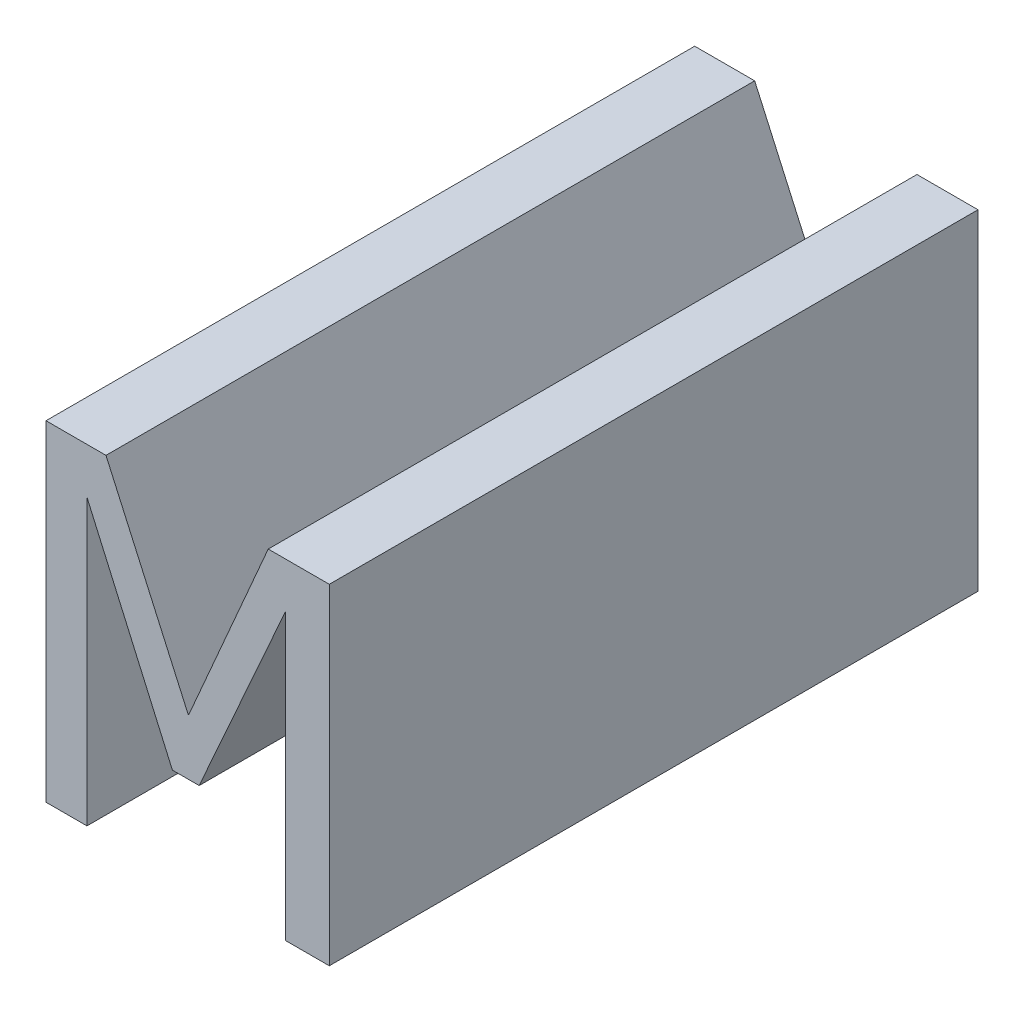
ISO-10303-21;
HEADER;
FILE_DESCRIPTION(('STEP AP214'),'2;1');
FILE_NAME('part.step','',(''),(''),'','','');
FILE_SCHEMA(('AUTOMOTIVE_DESIGN { 1 0 10303 214 1 1 1 1 }'));
ENDSEC;
DATA;
#1=APPLICATION_CONTEXT('core data for automotive mechanical design processes');
#2=APPLICATION_PROTOCOL_DEFINITION('international standard','automotive_design',2000,#1);
#3=PRODUCT_CONTEXT('',#1,'mechanical');
#4=PRODUCT('Part','Part','',(#3));
#5=PRODUCT_RELATED_PRODUCT_CATEGORY('part','',(#4));
#6=PRODUCT_DEFINITION_FORMATION('','',#4);
#7=PRODUCT_DEFINITION_CONTEXT('part definition',#1,'design');
#8=PRODUCT_DEFINITION('design','',#6,#7);
#9=PRODUCT_DEFINITION_SHAPE('','',#8);
#10=(LENGTH_UNIT() NAMED_UNIT(*) SI_UNIT(.MILLI.,.METRE.));
#11=(NAMED_UNIT(*) PLANE_ANGLE_UNIT() SI_UNIT($,.RADIAN.));
#12=(NAMED_UNIT(*) SI_UNIT($,.STERADIAN.) SOLID_ANGLE_UNIT());
#13=UNCERTAINTY_MEASURE_WITH_UNIT(LENGTH_MEASURE(1.E-05),#10,'distance_accuracy_value','');
#14=(GEOMETRIC_REPRESENTATION_CONTEXT(3) GLOBAL_UNCERTAINTY_ASSIGNED_CONTEXT((#13)) GLOBAL_UNIT_ASSIGNED_CONTEXT((#10,
#11,#12)) REPRESENTATION_CONTEXT('',''));
#15=CARTESIAN_POINT('',(0.,0.,0.));
#16=DIRECTION('',(0.,0.,1.));
#17=DIRECTION('',(1.,0.,0.));
#18=AXIS2_PLACEMENT_3D('',#15,#16,#17);
#19=CARTESIAN_POINT('',(-2.065839666338,-1.86200970024,0.));
#20=DIRECTION('',(-1.,0.,0.));
#21=DIRECTION('',(0.,-1.,0.));
#22=AXIS2_PLACEMENT_3D('',#19,#20,#21);
#23=PLANE('',#22);
#24=DIRECTION('',(0.,1.,0.));
#25=VECTOR('',#24,1.);
#26=CARTESIAN_POINT('',(-2.065839666338,-1.905886879973,0.));
#27=LINE('',#26,#25);
#28=CARTESIAN_POINT('',(-2.065839666338,-1.905886879973,0.));
#29=VERTEX_POINT('',#28);
#30=CARTESIAN_POINT('',(-2.065839666338,-1.86200970024,0.));
#31=VERTEX_POINT('',#30);
#32=EDGE_CURVE('E11',#29,#31,#27,.T.);
#33=ORIENTED_EDGE('',*,*,#32,.F.);
#34=DIRECTION('',(0.,0.,1.));
#35=VECTOR('',#34,1.);
#36=CARTESIAN_POINT('',(-2.065839666338,-1.905886879973,0.));
#37=LINE('',#36,#35);
#38=CARTESIAN_POINT('',(-2.065839666338,-1.905886879973,0.1));
#39=VERTEX_POINT('',#38);
#40=EDGE_CURVE('E24',#29,#39,#37,.T.);
#41=ORIENTED_EDGE('',*,*,#40,.T.);
#42=DIRECTION('',(0.,-1.,0.));
#43=VECTOR('',#42,1.);
#44=CARTESIAN_POINT('',(-2.065839666338,-1.905886879973,0.1));
#45=LINE('',#44,#43);
#46=CARTESIAN_POINT('',(-2.065839666338,-1.86200970024,0.1));
#47=VERTEX_POINT('',#46);
#48=EDGE_CURVE('E130',#47,#39,#45,.T.);
#49=ORIENTED_EDGE('',*,*,#48,.F.);
#50=DIRECTION('',(0.,0.,1.));
#51=VECTOR('',#50,1.);
#52=CARTESIAN_POINT('',(-2.065839666338,-1.86200970024,0.));
#53=LINE('',#52,#51);
#54=EDGE_CURVE('E211',#31,#47,#53,.T.);
#55=ORIENTED_EDGE('',*,*,#54,.F.);
#56=EDGE_LOOP('',(#33,#41,#49,#55));
#57=FACE_BOUND('',#56,.T.);
#58=ADVANCED_FACE('F17',(#57),#23,.T.);
#59=CARTESIAN_POINT('',(-2.079130778166,-1.891852786737,0.));
#60=DIRECTION('',(0.913498663408962,-0.406841728378543,0.));
#61=DIRECTION('',(0.406841728378543,0.913498663408962,0.));
#62=AXIS2_PLACEMENT_3D('',#59,#60,#61);
#63=PLANE('',#62);
#64=DIRECTION('',(-0.406841728378543,-0.913498663408962,0.));
#65=VECTOR('',#64,1.);
#66=CARTESIAN_POINT('',(-2.065839666338,-1.86200970024,0.));
#67=LINE('',#66,#65);
#68=CARTESIAN_POINT('',(-2.079130778166,-1.891852786737,0.));
#69=VERTEX_POINT('',#68);
#70=EDGE_CURVE('E209',#31,#69,#67,.T.);
#71=ORIENTED_EDGE('',*,*,#70,.F.);
#72=ORIENTED_EDGE('',*,*,#54,.T.);
#73=DIRECTION('',(0.406841728378543,0.913498663408962,0.));
#74=VECTOR('',#73,1.);
#75=CARTESIAN_POINT('',(-2.065839666338,-1.86200970024,0.1));
#76=LINE('',#75,#74);
#77=CARTESIAN_POINT('',(-2.079130778166,-1.891852786737,0.1));
#78=VERTEX_POINT('',#77);
#79=EDGE_CURVE('E207',#78,#47,#76,.T.);
#80=ORIENTED_EDGE('',*,*,#79,.F.);
#81=DIRECTION('',(0.,0.,1.));
#82=VECTOR('',#81,1.);
#83=CARTESIAN_POINT('',(-2.079130778166,-1.891852786737,0.));
#84=LINE('',#83,#82);
#85=EDGE_CURVE('E204',#69,#78,#84,.T.);
#86=ORIENTED_EDGE('',*,*,#85,.F.);
#87=EDGE_LOOP('',(#71,#72,#80,#86));
#88=FACE_BOUND('',#87,.T.);
#89=ADVANCED_FACE('F253',(#88),#63,.T.);
#90=CARTESIAN_POINT('',(-2.083258452647,-1.891852786737,0.));
#91=DIRECTION('',(0.,-1.,0.));
#92=DIRECTION('',(1.,0.,0.));
#93=AXIS2_PLACEMENT_3D('',#90,#91,#92);
#94=PLANE('',#93);
#95=DIRECTION('',(-1.,0.,0.));
#96=VECTOR('',#95,1.);
#97=CARTESIAN_POINT('',(-2.079130778166,-1.891852786737,0.));
#98=LINE('',#97,#96);
#99=CARTESIAN_POINT('',(-2.083258452647,-1.891852786737,0.));
#100=VERTEX_POINT('',#99);
#101=EDGE_CURVE('E202',#69,#100,#98,.T.);
#102=ORIENTED_EDGE('',*,*,#101,.F.);
#103=ORIENTED_EDGE('',*,*,#85,.T.);
#104=DIRECTION('',(1.,0.,0.));
#105=VECTOR('',#104,1.);
#106=CARTESIAN_POINT('',(-2.079130778166,-1.891852786737,0.1));
#107=LINE('',#106,#105);
#108=CARTESIAN_POINT('',(-2.083258452647,-1.891852786737,0.1));
#109=VERTEX_POINT('',#108);
#110=EDGE_CURVE('E199',#109,#78,#107,.T.);
#111=ORIENTED_EDGE('',*,*,#110,.F.);
#112=DIRECTION('',(0.,0.,1.));
#113=VECTOR('',#112,1.);
#114=CARTESIAN_POINT('',(-2.083258452647,-1.891852786737,0.));
#115=LINE('',#114,#113);
#116=EDGE_CURVE('E196',#100,#109,#115,.T.);
#117=ORIENTED_EDGE('',*,*,#116,.F.);
#118=EDGE_LOOP('',(#102,#103,#111,#117));
#119=FACE_BOUND('',#118,.T.);
#120=ADVANCED_FACE('F249',(#119),#94,.T.);
#121=CARTESIAN_POINT('',(-2.096425734242,-1.86200970024,0.));
#122=DIRECTION('',(-0.914904056356066,-0.403671360964854,0.));
#123=DIRECTION('',(0.403671360964854,-0.914904056356066,0.));
#124=AXIS2_PLACEMENT_3D('',#121,#122,#123);
#125=PLANE('',#124);
#126=DIRECTION('',(-0.403671360964854,0.914904056356065,0.));
#127=VECTOR('',#126,1.);
#128=CARTESIAN_POINT('',(-2.083258452647,-1.891852786737,0.));
#129=LINE('',#128,#127);
#130=CARTESIAN_POINT('',(-2.096425734242,-1.86200970024,0.));
#131=VERTEX_POINT('',#130);
#132=EDGE_CURVE('E194',#100,#131,#129,.T.);
#133=ORIENTED_EDGE('',*,*,#132,.F.);
#134=ORIENTED_EDGE('',*,*,#116,.T.);
#135=DIRECTION('',(0.403671360964854,-0.914904056356065,0.));
#136=VECTOR('',#135,1.);
#137=CARTESIAN_POINT('',(-2.083258452647,-1.891852786737,0.1));
#138=LINE('',#137,#136);
#139=CARTESIAN_POINT('',(-2.096425734242,-1.86200970024,0.1));
#140=VERTEX_POINT('',#139);
#141=EDGE_CURVE('E191',#140,#109,#138,.T.);
#142=ORIENTED_EDGE('',*,*,#141,.F.);
#143=DIRECTION('',(0.,0.,1.));
#144=VECTOR('',#143,1.);
#145=CARTESIAN_POINT('',(-2.096425734242,-1.86200970024,0.));
#146=LINE('',#145,#144);
#147=EDGE_CURVE('E188',#131,#140,#146,.T.);
#148=ORIENTED_EDGE('',*,*,#147,.F.);
#149=EDGE_LOOP('',(#133,#134,#142,#148));
#150=FACE_BOUND('',#149,.T.);
#151=ADVANCED_FACE('F245',(#150),#125,.T.);
#152=CARTESIAN_POINT('',(-2.096425734242,-1.905886879973,0.));
#153=DIRECTION('',(1.,0.,0.));
#154=DIRECTION('',(0.,1.,0.));
#155=AXIS2_PLACEMENT_3D('',#152,#153,#154);
#156=PLANE('',#155);
#157=DIRECTION('',(0.,-1.,0.));
#158=VECTOR('',#157,1.);
#159=CARTESIAN_POINT('',(-2.096425734242,-1.86200970024,0.));
#160=LINE('',#159,#158);
#161=CARTESIAN_POINT('',(-2.096425734242,-1.905886879973,0.));
#162=VERTEX_POINT('',#161);
#163=EDGE_CURVE('E186',#131,#162,#160,.T.);
#164=ORIENTED_EDGE('',*,*,#163,.F.);
#165=ORIENTED_EDGE('',*,*,#147,.T.);
#166=DIRECTION('',(0.,1.,0.));
#167=VECTOR('',#166,1.);
#168=CARTESIAN_POINT('',(-2.096425734242,-1.86200970024,0.1));
#169=LINE('',#168,#167);
#170=CARTESIAN_POINT('',(-2.096425734242,-1.905886879973,0.1));
#171=VERTEX_POINT('',#170);
#172=EDGE_CURVE('E183',#171,#140,#169,.T.);
#173=ORIENTED_EDGE('',*,*,#172,.F.);
#174=DIRECTION('',(0.,0.,1.));
#175=VECTOR('',#174,1.);
#176=CARTESIAN_POINT('',(-2.096425734242,-1.905886879973,0.));
#177=LINE('',#176,#175);
#178=EDGE_CURVE('E180',#162,#171,#177,.T.);
#179=ORIENTED_EDGE('',*,*,#178,.F.);
#180=EDGE_LOOP('',(#164,#165,#173,#179));
#181=FACE_BOUND('',#180,.T.);
#182=ADVANCED_FACE('F241',(#181),#156,.T.);
#183=CARTESIAN_POINT('',(-2.102741076198,-1.905886879973,0.));
#184=DIRECTION('',(0.,-1.,0.));
#185=DIRECTION('',(1.,0.,0.));
#186=AXIS2_PLACEMENT_3D('',#183,#184,#185);
#187=PLANE('',#186);
#188=DIRECTION('',(-1.,0.,0.));
#189=VECTOR('',#188,1.);
#190=CARTESIAN_POINT('',(-2.096425734242,-1.905886879973,0.));
#191=LINE('',#190,#189);
#192=CARTESIAN_POINT('',(-2.102741076198,-1.905886879973,0.));
#193=VERTEX_POINT('',#192);
#194=EDGE_CURVE('E178',#162,#193,#191,.T.);
#195=ORIENTED_EDGE('',*,*,#194,.F.);
#196=ORIENTED_EDGE('',*,*,#178,.T.);
#197=DIRECTION('',(1.,0.,0.));
#198=VECTOR('',#197,1.);
#199=CARTESIAN_POINT('',(-2.096425734242,-1.905886879973,0.1));
#200=LINE('',#199,#198);
#201=CARTESIAN_POINT('',(-2.102741076198,-1.905886879973,0.1));
#202=VERTEX_POINT('',#201);
#203=EDGE_CURVE('E175',#202,#171,#200,.T.);
#204=ORIENTED_EDGE('',*,*,#203,.F.);
#205=DIRECTION('',(0.,0.,1.));
#206=VECTOR('',#205,1.);
#207=CARTESIAN_POINT('',(-2.102741076198,-1.905886879973,0.));
#208=LINE('',#207,#206);
#209=EDGE_CURVE('E172',#193,#202,#208,.T.);
#210=ORIENTED_EDGE('',*,*,#209,.F.);
#211=EDGE_LOOP('',(#195,#196,#204,#210));
#212=FACE_BOUND('',#211,.T.);
#213=ADVANCED_FACE('F237',(#212),#187,.T.);
#214=CARTESIAN_POINT('',(-2.102741076198,-1.854951376877,0.));
#215=DIRECTION('',(-1.,0.,0.));
#216=DIRECTION('',(0.,-1.,0.));
#217=AXIS2_PLACEMENT_3D('',#214,#215,#216);
#218=PLANE('',#217);
#219=DIRECTION('',(0.,1.,0.));
#220=VECTOR('',#219,1.);
#221=CARTESIAN_POINT('',(-2.102741076198,-1.905886879973,0.));
#222=LINE('',#221,#220);
#223=CARTESIAN_POINT('',(-2.102741076198,-1.854951376877,0.));
#224=VERTEX_POINT('',#223);
#225=EDGE_CURVE('E170',#193,#224,#222,.T.);
#226=ORIENTED_EDGE('',*,*,#225,.F.);
#227=ORIENTED_EDGE('',*,*,#209,.T.);
#228=DIRECTION('',(0.,-1.,0.));
#229=VECTOR('',#228,1.);
#230=CARTESIAN_POINT('',(-2.102741076198,-1.905886879973,0.1));
#231=LINE('',#230,#229);
#232=CARTESIAN_POINT('',(-2.102741076198,-1.854951376877,0.1));
#233=VERTEX_POINT('',#232);
#234=EDGE_CURVE('E167',#233,#202,#231,.T.);
#235=ORIENTED_EDGE('',*,*,#234,.F.);
#236=DIRECTION('',(0.,0.,1.));
#237=VECTOR('',#236,1.);
#238=CARTESIAN_POINT('',(-2.102741076198,-1.854951376877,0.));
#239=LINE('',#238,#237);
#240=EDGE_CURVE('E164',#224,#233,#239,.T.);
#241=ORIENTED_EDGE('',*,*,#240,.F.);
#242=EDGE_LOOP('',(#226,#227,#235,#241));
#243=FACE_BOUND('',#242,.T.);
#244=ADVANCED_FACE('F233',(#243),#218,.T.);
#245=CARTESIAN_POINT('',(-2.09349508536,-1.854951376877,0.));
#246=DIRECTION('',(0.,1.,0.));
#247=DIRECTION('',(-1.,0.,0.));
#248=AXIS2_PLACEMENT_3D('',#245,#246,#247);
#249=PLANE('',#248);
#250=DIRECTION('',(1.,0.,0.));
#251=VECTOR('',#250,1.);
#252=CARTESIAN_POINT('',(-2.102741076198,-1.854951376877,0.));
#253=LINE('',#252,#251);
#254=CARTESIAN_POINT('',(-2.09349508536,-1.854951376877,0.));
#255=VERTEX_POINT('',#254);
#256=EDGE_CURVE('E162',#224,#255,#253,.T.);
#257=ORIENTED_EDGE('',*,*,#256,.F.);
#258=ORIENTED_EDGE('',*,*,#240,.T.);
#259=DIRECTION('',(-1.,0.,0.));
#260=VECTOR('',#259,1.);
#261=CARTESIAN_POINT('',(-2.102741076198,-1.854951376877,0.1));
#262=LINE('',#261,#260);
#263=CARTESIAN_POINT('',(-2.09349508536,-1.854951376877,0.1));
#264=VERTEX_POINT('',#263);
#265=EDGE_CURVE('E159',#264,#233,#262,.T.);
#266=ORIENTED_EDGE('',*,*,#265,.F.);
#267=DIRECTION('',(0.,0.,1.));
#268=VECTOR('',#267,1.);
#269=CARTESIAN_POINT('',(-2.09349508536,-1.854951376877,0.));
#270=LINE('',#269,#268);
#271=EDGE_CURVE('E156',#255,#264,#270,.T.);
#272=ORIENTED_EDGE('',*,*,#271,.F.);
#273=EDGE_LOOP('',(#257,#258,#266,#272));
#274=FACE_BOUND('',#273,.T.);
#275=ADVANCED_FACE('F229',(#274),#249,.T.);
#276=CARTESIAN_POINT('',(-2.080781847959,-1.883308500562,0.));
#277=DIRECTION('',(0.912492227721687,0.409094040958205,0.));
#278=DIRECTION('',(-0.409094040958205,0.912492227721687,0.));
#279=AXIS2_PLACEMENT_3D('',#276,#277,#278);
#280=PLANE('',#279);
#281=DIRECTION('',(0.409094040958205,-0.912492227721687,0.));
#282=VECTOR('',#281,1.);
#283=CARTESIAN_POINT('',(-2.09349508536,-1.854951376877,0.));
#284=LINE('',#283,#282);
#285=CARTESIAN_POINT('',(-2.080781847959,-1.883308500562,0.));
#286=VERTEX_POINT('',#285);
#287=EDGE_CURVE('E154',#255,#286,#284,.T.);
#288=ORIENTED_EDGE('',*,*,#287,.F.);
#289=ORIENTED_EDGE('',*,*,#271,.T.);
#290=DIRECTION('',(-0.409094040958205,0.912492227721687,0.));
#291=VECTOR('',#290,1.);
#292=CARTESIAN_POINT('',(-2.09349508536,-1.854951376877,0.1));
#293=LINE('',#292,#291);
#294=CARTESIAN_POINT('',(-2.080781847959,-1.883308500562,0.1));
#295=VERTEX_POINT('',#294);
#296=EDGE_CURVE('E151',#295,#264,#293,.T.);
#297=ORIENTED_EDGE('',*,*,#296,.F.);
#298=DIRECTION('',(0.,0.,1.));
#299=VECTOR('',#298,1.);
#300=CARTESIAN_POINT('',(-2.080781847959,-1.883308500562,0.));
#301=LINE('',#300,#299);
#302=EDGE_CURVE('E148',#286,#295,#301,.T.);
#303=ORIENTED_EDGE('',*,*,#302,.F.);
#304=EDGE_LOOP('',(#288,#289,#297,#303));
#305=FACE_BOUND('',#304,.T.);
#306=ADVANCED_FACE('F225',(#305),#280,.T.);
#307=CARTESIAN_POINT('',(-2.068481378005,-1.854951376877,0.));
#308=DIRECTION('',(-0.917409408006232,0.39794469226471,0.));
#309=DIRECTION('',(-0.39794469226471,-0.917409408006232,0.));
#310=AXIS2_PLACEMENT_3D('',#307,#308,#309);
#311=PLANE('',#310);
#312=DIRECTION('',(0.39794469226471,0.917409408006232,0.));
#313=VECTOR('',#312,1.);
#314=CARTESIAN_POINT('',(-2.080781847959,-1.883308500562,0.));
#315=LINE('',#314,#313);
#316=CARTESIAN_POINT('',(-2.068481378005,-1.854951376877,0.));
#317=VERTEX_POINT('',#316);
#318=EDGE_CURVE('E146',#286,#317,#315,.T.);
#319=ORIENTED_EDGE('',*,*,#318,.F.);
#320=ORIENTED_EDGE('',*,*,#302,.T.);
#321=DIRECTION('',(-0.39794469226471,-0.917409408006232,0.));
#322=VECTOR('',#321,1.);
#323=CARTESIAN_POINT('',(-2.080781847959,-1.883308500562,0.1));
#324=LINE('',#323,#322);
#325=CARTESIAN_POINT('',(-2.068481378005,-1.854951376877,0.1));
#326=VERTEX_POINT('',#325);
#327=EDGE_CURVE('E143',#326,#295,#324,.T.);
#328=ORIENTED_EDGE('',*,*,#327,.F.);
#329=DIRECTION('',(0.,0.,1.));
#330=VECTOR('',#329,1.);
#331=CARTESIAN_POINT('',(-2.068481378005,-1.854951376877,0.));
#332=LINE('',#331,#330);
#333=EDGE_CURVE('E140',#317,#326,#332,.T.);
#334=ORIENTED_EDGE('',*,*,#333,.F.);
#335=EDGE_LOOP('',(#319,#320,#328,#334));
#336=FACE_BOUND('',#335,.T.);
#337=ADVANCED_FACE('F221',(#336),#311,.T.);
#338=CARTESIAN_POINT('',(-2.059070280189,-1.854951376877,0.));
#339=DIRECTION('',(0.,1.,0.));
#340=DIRECTION('',(-1.,0.,0.));
#341=AXIS2_PLACEMENT_3D('',#338,#339,#340);
#342=PLANE('',#341);
#343=DIRECTION('',(1.,0.,0.));
#344=VECTOR('',#343,1.);
#345=CARTESIAN_POINT('',(-2.068481378005,-1.854951376877,0.));
#346=LINE('',#345,#344);
#347=CARTESIAN_POINT('',(-2.059070280189,-1.854951376877,0.));
#348=VERTEX_POINT('',#347);
#349=EDGE_CURVE('E138',#317,#348,#346,.T.);
#350=ORIENTED_EDGE('',*,*,#349,.F.);
#351=ORIENTED_EDGE('',*,*,#333,.T.);
#352=DIRECTION('',(-1.,0.,0.));
#353=VECTOR('',#352,1.);
#354=CARTESIAN_POINT('',(-2.068481378005,-1.854951376877,0.1));
#355=LINE('',#354,#353);
#356=CARTESIAN_POINT('',(-2.059070280189,-1.854951376877,0.1));
#357=VERTEX_POINT('',#356);
#358=EDGE_CURVE('E136',#357,#326,#355,.T.);
#359=ORIENTED_EDGE('',*,*,#358,.F.);
#360=DIRECTION('',(0.,0.,1.));
#361=VECTOR('',#360,1.);
#362=CARTESIAN_POINT('',(-2.059070280189,-1.854951376877,0.));
#363=LINE('',#362,#361);
#364=EDGE_CURVE('E115',#348,#357,#363,.T.);
#365=ORIENTED_EDGE('',*,*,#364,.F.);
#366=EDGE_LOOP('',(#350,#351,#359,#365));
#367=FACE_BOUND('',#366,.T.);
#368=ADVANCED_FACE('F219',(#367),#342,.T.);
#369=CARTESIAN_POINT('',(-2.059070280189,-1.905886879973,0.));
#370=DIRECTION('',(1.,0.,0.));
#371=DIRECTION('',(0.,1.,0.));
#372=AXIS2_PLACEMENT_3D('',#369,#370,#371);
#373=PLANE('',#372);
#374=DIRECTION('',(0.,-1.,0.));
#375=VECTOR('',#374,1.);
#376=CARTESIAN_POINT('',(-2.059070280189,-1.854951376877,0.));
#377=LINE('',#376,#375);
#378=CARTESIAN_POINT('',(-2.059070280189,-1.905886879973,0.));
#379=VERTEX_POINT('',#378);
#380=EDGE_CURVE('E119',#348,#379,#377,.T.);
#381=ORIENTED_EDGE('',*,*,#380,.F.);
#382=ORIENTED_EDGE('',*,*,#364,.T.);
#383=DIRECTION('',(0.,1.,0.));
#384=VECTOR('',#383,1.);
#385=CARTESIAN_POINT('',(-2.059070280189,-1.854951376877,0.1));
#386=LINE('',#385,#384);
#387=CARTESIAN_POINT('',(-2.059070280189,-1.905886879973,0.1));
#388=VERTEX_POINT('',#387);
#389=EDGE_CURVE('E108',#388,#357,#386,.T.);
#390=ORIENTED_EDGE('',*,*,#389,.F.);
#391=DIRECTION('',(0.,0.,1.));
#392=VECTOR('',#391,1.);
#393=CARTESIAN_POINT('',(-2.059070280189,-1.905886879973,0.));
#394=LINE('',#393,#392);
#395=EDGE_CURVE('E112',#379,#388,#394,.T.);
#396=ORIENTED_EDGE('',*,*,#395,.F.);
#397=EDGE_LOOP('',(#381,#382,#390,#396));
#398=FACE_BOUND('',#397,.T.);
#399=ADVANCED_FACE('F111',(#398),#373,.T.);
#400=CARTESIAN_POINT('',(-2.065839666338,-1.905886879973,0.));
#401=DIRECTION('',(0.,-1.,0.));
#402=DIRECTION('',(1.,0.,0.));
#403=AXIS2_PLACEMENT_3D('',#400,#401,#402);
#404=PLANE('',#403);
#405=DIRECTION('',(-1.,0.,0.));
#406=VECTOR('',#405,1.);
#407=CARTESIAN_POINT('',(-2.059070280189,-1.905886879973,0.));
#408=LINE('',#407,#406);
#409=EDGE_CURVE('E125',#379,#29,#408,.T.);
#410=ORIENTED_EDGE('',*,*,#409,.F.);
#411=ORIENTED_EDGE('',*,*,#395,.T.);
#412=DIRECTION('',(1.,0.,0.));
#413=VECTOR('',#412,1.);
#414=CARTESIAN_POINT('',(-2.059070280189,-1.905886879973,0.1));
#415=LINE('',#414,#413);
#416=EDGE_CURVE('E124',#39,#388,#415,.T.);
#417=ORIENTED_EDGE('',*,*,#416,.F.);
#418=ORIENTED_EDGE('',*,*,#40,.F.);
#419=EDGE_LOOP('',(#410,#411,#417,#418));
#420=FACE_BOUND('',#419,.T.);
#421=ADVANCED_FACE('F123',(#420),#404,.T.);
#422=CARTESIAN_POINT('',(-2.080985832171,-1.878399348528,0.));
#423=DIRECTION('',(0.,0.,1.));
#424=DIRECTION('',(1.,0.,0.));
#425=AXIS2_PLACEMENT_3D('',#422,#423,#424);
#426=PLANE('',#425);
#427=ORIENTED_EDGE('',*,*,#409,.T.);
#428=ORIENTED_EDGE('',*,*,#32,.T.);
#429=ORIENTED_EDGE('',*,*,#70,.T.);
#430=ORIENTED_EDGE('',*,*,#101,.T.);
#431=ORIENTED_EDGE('',*,*,#132,.T.);
#432=ORIENTED_EDGE('',*,*,#163,.T.);
#433=ORIENTED_EDGE('',*,*,#194,.T.);
#434=ORIENTED_EDGE('',*,*,#225,.T.);
#435=ORIENTED_EDGE('',*,*,#256,.T.);
#436=ORIENTED_EDGE('',*,*,#287,.T.);
#437=ORIENTED_EDGE('',*,*,#318,.T.);
#438=ORIENTED_EDGE('',*,*,#349,.T.);
#439=ORIENTED_EDGE('',*,*,#380,.T.);
#440=EDGE_LOOP('',(#427,#428,#429,#430,#431,#432,#433,#434,#435,#436,#437,#438,#439));
#441=FACE_BOUND('',#440,.T.);
#442=ADVANCED_FACE('F214',(#441),#426,.F.);
#443=CARTESIAN_POINT('',(-2.080985832171,-1.878399348528,0.1));
#444=DIRECTION('',(0.,0.,1.));
#445=DIRECTION('',(1.,0.,0.));
#446=AXIS2_PLACEMENT_3D('',#443,#444,#445);
#447=PLANE('',#446);
#448=ORIENTED_EDGE('',*,*,#416,.T.);
#449=ORIENTED_EDGE('',*,*,#389,.T.);
#450=ORIENTED_EDGE('',*,*,#358,.T.);
#451=ORIENTED_EDGE('',*,*,#327,.T.);
#452=ORIENTED_EDGE('',*,*,#296,.T.);
#453=ORIENTED_EDGE('',*,*,#265,.T.);
#454=ORIENTED_EDGE('',*,*,#234,.T.);
#455=ORIENTED_EDGE('',*,*,#203,.T.);
#456=ORIENTED_EDGE('',*,*,#172,.T.);
#457=ORIENTED_EDGE('',*,*,#141,.T.);
#458=ORIENTED_EDGE('',*,*,#110,.T.);
#459=ORIENTED_EDGE('',*,*,#79,.T.);
#460=ORIENTED_EDGE('',*,*,#48,.T.);
#461=EDGE_LOOP('',(#448,#449,#450,#451,#452,#453,#454,#455,#456,#457,#458,#459,#460));
#462=FACE_BOUND('',#461,.T.);
#463=ADVANCED_FACE('F128',(#462),#447,.T.);
#464=CLOSED_SHELL('',(#58,#89,#120,#151,#182,#213,#244,#275,#306,#337,#368,#399,#421,#442,#463));
#465=MANIFOLD_SOLID_BREP('B1',#464);
#466=ADVANCED_BREP_SHAPE_REPRESENTATION('',(#18,#465),#14);
#467=SHAPE_DEFINITION_REPRESENTATION(#9,#466);
ENDSEC;
END-ISO-10303-21;
